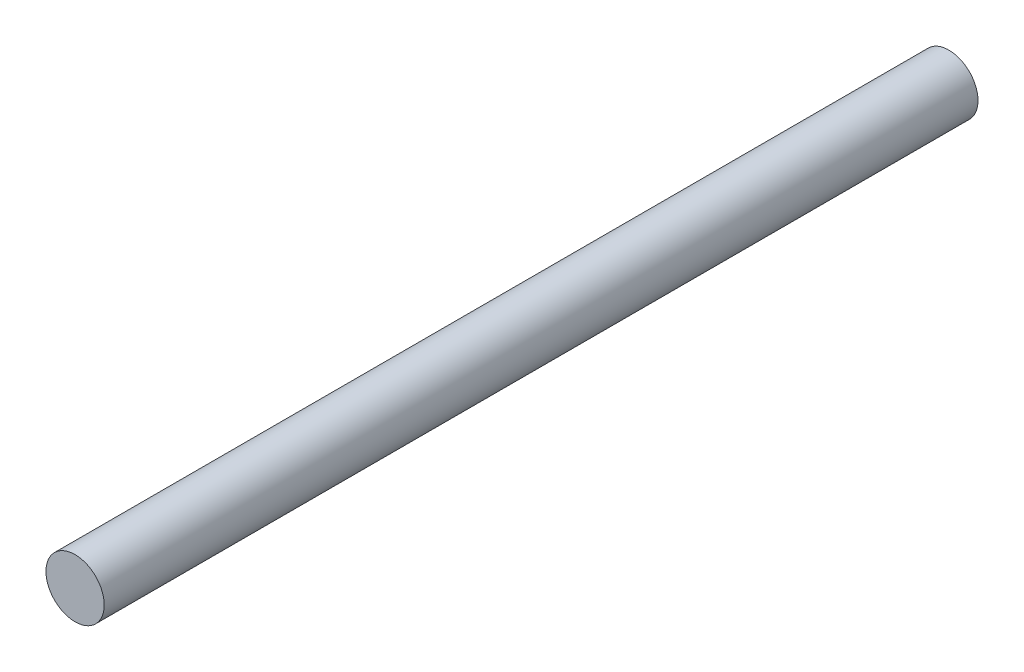
ISO-10303-21;
HEADER;
FILE_DESCRIPTION(('STEP AP214'),'2;1');
FILE_NAME('part.step','',(''),(''),'','','');
FILE_SCHEMA(('AUTOMOTIVE_DESIGN { 1 0 10303 214 1 1 1 1 }'));
ENDSEC;
DATA;
#1=APPLICATION_CONTEXT('core data for automotive mechanical design processes');
#2=APPLICATION_PROTOCOL_DEFINITION('international standard','automotive_design',2000,#1);
#3=PRODUCT_CONTEXT('',#1,'mechanical');
#4=PRODUCT('Part','Part','',(#3));
#5=PRODUCT_RELATED_PRODUCT_CATEGORY('part','',(#4));
#6=PRODUCT_DEFINITION_FORMATION('','',#4);
#7=PRODUCT_DEFINITION_CONTEXT('part definition',#1,'design');
#8=PRODUCT_DEFINITION('design','',#6,#7);
#9=PRODUCT_DEFINITION_SHAPE('','',#8);
#10=(LENGTH_UNIT() NAMED_UNIT(*) SI_UNIT(.MILLI.,.METRE.));
#11=(NAMED_UNIT(*) PLANE_ANGLE_UNIT() SI_UNIT($,.RADIAN.));
#12=(NAMED_UNIT(*) SI_UNIT($,.STERADIAN.) SOLID_ANGLE_UNIT());
#13=UNCERTAINTY_MEASURE_WITH_UNIT(LENGTH_MEASURE(1.E-05),#10,'distance_accuracy_value','');
#14=(GEOMETRIC_REPRESENTATION_CONTEXT(3) GLOBAL_UNCERTAINTY_ASSIGNED_CONTEXT((#13)) GLOBAL_UNIT_ASSIGNED_CONTEXT((#10,
#11,#12)) REPRESENTATION_CONTEXT('',''));
#15=CARTESIAN_POINT('',(0.,0.,0.));
#16=DIRECTION('',(0.,0.,1.));
#17=DIRECTION('',(1.,0.,0.));
#18=AXIS2_PLACEMENT_3D('',#15,#16,#17);
#19=CARTESIAN_POINT('',(0.,0.,762.));
#20=DIRECTION('',(0.,0.,-1.));
#21=DIRECTION('',(-1.,0.,0.));
#22=AXIS2_PLACEMENT_3D('',#19,#20,#21);
#23=CYLINDRICAL_SURFACE('',#22,25.4);
#24=CARTESIAN_POINT('',(0.,0.,762.));
#25=DIRECTION('',(0.,0.,1.));
#26=DIRECTION('',(1.,0.,0.));
#27=AXIS2_PLACEMENT_3D('',#24,#25,#26);
#28=CIRCLE('',#27,25.4);
#29=CARTESIAN_POINT('',(25.4,0.,762.));
#30=VERTEX_POINT('',#29);
#31=EDGE_CURVE('E10',#30,#30,#28,.T.);
#32=ORIENTED_EDGE('',*,*,#31,.F.);
#33=EDGE_LOOP('',(#32));
#34=FACE_BOUND('',#33,.T.);
#35=CARTESIAN_POINT('',(0.,0.,0.));
#36=DIRECTION('',(0.,0.,1.));
#37=DIRECTION('',(1.,0.,0.));
#38=AXIS2_PLACEMENT_3D('',#35,#36,#37);
#39=CIRCLE('',#38,25.4);
#40=CARTESIAN_POINT('',(25.4,0.,0.));
#41=VERTEX_POINT('',#40);
#42=EDGE_CURVE('E40',#41,#41,#39,.T.);
#43=ORIENTED_EDGE('',*,*,#42,.T.);
#44=EDGE_LOOP('',(#43));
#45=FACE_BOUND('',#44,.T.);
#46=ADVANCED_FACE('F37',(#34,#45),#23,.T.);
#47=CARTESIAN_POINT('',(0.,0.,762.));
#48=DIRECTION('',(0.,0.,1.));
#49=DIRECTION('',(1.,0.,0.));
#50=AXIS2_PLACEMENT_3D('',#47,#48,#49);
#51=PLANE('',#50);
#52=ORIENTED_EDGE('',*,*,#31,.T.);
#53=EDGE_LOOP('',(#52));
#54=FACE_BOUND('',#53,.T.);
#55=ADVANCED_FACE('F54',(#54),#51,.T.);
#56=CARTESIAN_POINT('',(0.,0.,0.));
#57=DIRECTION('',(0.,0.,1.));
#58=DIRECTION('',(1.,0.,0.));
#59=AXIS2_PLACEMENT_3D('',#56,#57,#58);
#60=PLANE('',#59);
#61=ORIENTED_EDGE('',*,*,#42,.F.);
#62=EDGE_LOOP('',(#61));
#63=FACE_BOUND('',#62,.T.);
#64=ADVANCED_FACE('F52',(#63),#60,.F.);
#65=CLOSED_SHELL('',(#46,#55,#64));
#66=MANIFOLD_SOLID_BREP('B2',#65);
#67=ADVANCED_BREP_SHAPE_REPRESENTATION('',(#18,#66),#14);
#68=SHAPE_DEFINITION_REPRESENTATION(#9,#67);
ENDSEC;
END-ISO-10303-21;
